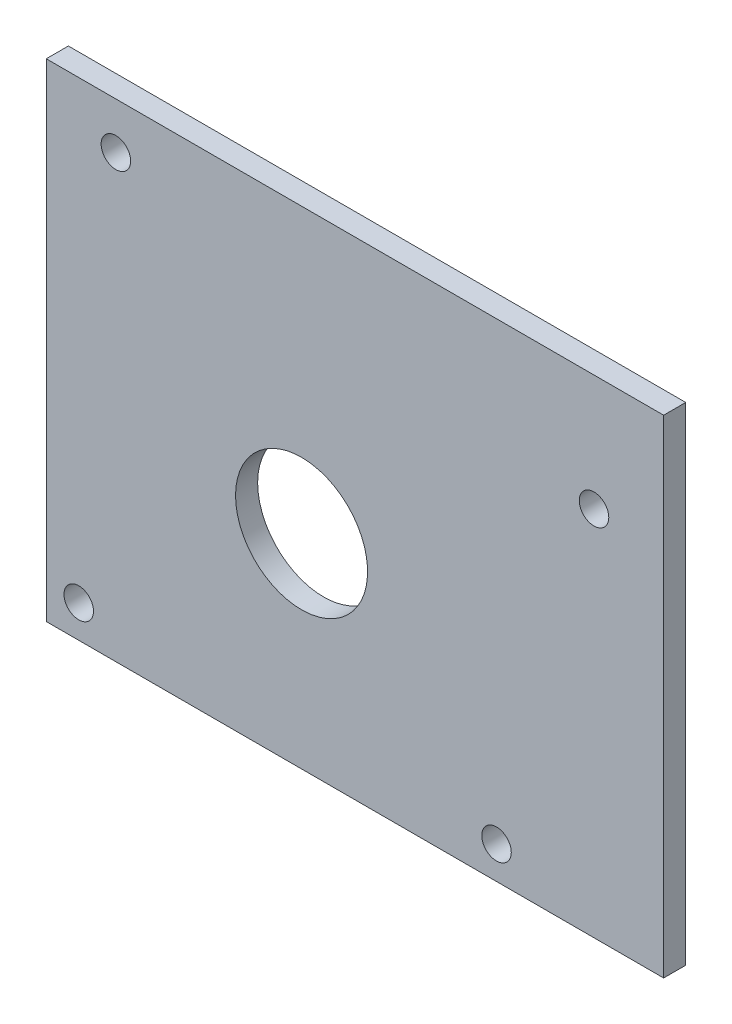
ISO-10303-21;
HEADER;
FILE_DESCRIPTION(('STEP AP214'),'2;1');
FILE_NAME('part.step','',(''),(''),'','','');
FILE_SCHEMA(('AUTOMOTIVE_DESIGN { 1 0 10303 214 1 1 1 1 }'));
ENDSEC;
DATA;
#1=APPLICATION_CONTEXT('core data for automotive mechanical design processes');
#2=APPLICATION_PROTOCOL_DEFINITION('international standard','automotive_design',2000,#1);
#3=PRODUCT_CONTEXT('',#1,'mechanical');
#4=PRODUCT('Part','Part','',(#3));
#5=PRODUCT_RELATED_PRODUCT_CATEGORY('part','',(#4));
#6=PRODUCT_DEFINITION_FORMATION('','',#4);
#7=PRODUCT_DEFINITION_CONTEXT('part definition',#1,'design');
#8=PRODUCT_DEFINITION('design','',#6,#7);
#9=PRODUCT_DEFINITION_SHAPE('','',#8);
#10=(LENGTH_UNIT() NAMED_UNIT(*) SI_UNIT(.MILLI.,.METRE.));
#11=(NAMED_UNIT(*) PLANE_ANGLE_UNIT() SI_UNIT($,.RADIAN.));
#12=(NAMED_UNIT(*) SI_UNIT($,.STERADIAN.) SOLID_ANGLE_UNIT());
#13=UNCERTAINTY_MEASURE_WITH_UNIT(LENGTH_MEASURE(1.E-05),#10,'distance_accuracy_value','');
#14=(GEOMETRIC_REPRESENTATION_CONTEXT(3) GLOBAL_UNCERTAINTY_ASSIGNED_CONTEXT((#13)) GLOBAL_UNIT_ASSIGNED_CONTEXT((#10,
#11,#12)) REPRESENTATION_CONTEXT('',''));
#15=CARTESIAN_POINT('',(0.,0.,0.));
#16=DIRECTION('',(0.,0.,1.));
#17=DIRECTION('',(1.,0.,0.));
#18=AXIS2_PLACEMENT_3D('',#15,#16,#17);
#19=CARTESIAN_POINT('',(0.,0.,4.7625));
#20=DIRECTION('',(0.,0.,-1.));
#21=DIRECTION('',(-1.,0.,0.));
#22=AXIS2_PLACEMENT_3D('',#19,#20,#21);
#23=PLANE('',#22);
#24=CARTESIAN_POINT('',(-70.0354609929079,64.3412711777844,4.7625));
#25=DIRECTION('',(0.,0.,1.));
#26=DIRECTION('',(1.,0.,0.));
#27=AXIS2_PLACEMENT_3D('',#24,#25,#26);
#28=CIRCLE('',#27,3.18);
#29=CARTESIAN_POINT('',(-66.8554609929079,64.3412711777844,4.7625));
#30=VERTEX_POINT('',#29);
#31=EDGE_CURVE('E115',#30,#30,#28,.T.);
#32=ORIENTED_EDGE('',*,*,#31,.F.);
#33=EDGE_LOOP('',(#32));
#34=FACE_BOUND('',#33,.T.);
#35=CARTESIAN_POINT('',(32.9645390070922,49.3412711777844,4.7625));
#36=DIRECTION('',(0.,0.,1.));
#37=DIRECTION('',(1.,0.,0.));
#38=AXIS2_PLACEMENT_3D('',#35,#36,#37);
#39=CIRCLE('',#38,3.18);
#40=CARTESIAN_POINT('',(36.1445390070922,49.3412711777844,4.7625));
#41=VERTEX_POINT('',#40);
#42=EDGE_CURVE('E133',#41,#41,#39,.T.);
#43=ORIENTED_EDGE('',*,*,#42,.F.);
#44=EDGE_LOOP('',(#43));
#45=FACE_BOUND('',#44,.T.);
#46=CARTESIAN_POINT('',(11.9645390070922,-23.6587288222156,4.7625));
#47=DIRECTION('',(0.,0.,1.));
#48=DIRECTION('',(1.,0.,0.));
#49=AXIS2_PLACEMENT_3D('',#46,#47,#48);
#50=CIRCLE('',#49,3.18);
#51=CARTESIAN_POINT('',(15.1445390070922,-23.6587288222156,4.7625));
#52=VERTEX_POINT('',#51);
#53=EDGE_CURVE('E127',#52,#52,#50,.T.);
#54=ORIENTED_EDGE('',*,*,#53,.F.);
#55=EDGE_LOOP('',(#54));
#56=FACE_BOUND('',#55,.T.);
#57=CARTESIAN_POINT('',(-78.0354609929079,-23.6587288222156,4.7625));
#58=DIRECTION('',(0.,0.,1.));
#59=DIRECTION('',(1.,0.,0.));
#60=AXIS2_PLACEMENT_3D('',#57,#58,#59);
#61=CIRCLE('',#60,3.18);
#62=CARTESIAN_POINT('',(-74.8554609929079,-23.6587288222156,4.7625));
#63=VERTEX_POINT('',#62);
#64=EDGE_CURVE('E121',#63,#63,#61,.T.);
#65=ORIENTED_EDGE('',*,*,#64,.F.);
#66=EDGE_LOOP('',(#65));
#67=FACE_BOUND('',#66,.T.);
#68=DIRECTION('',(-1.,0.,0.));
#69=VECTOR('',#68,1.);
#70=CARTESIAN_POINT('',(-85.0354609929079,74.3412711777844,4.7625));
#71=LINE('',#70,#69);
#72=CARTESIAN_POINT('',(47.9645390070921,74.3412711777844,4.7625));
#73=VERTEX_POINT('',#72);
#74=CARTESIAN_POINT('',(-85.0354609929079,74.3412711777844,4.7625));
#75=VERTEX_POINT('',#74);
#76=EDGE_CURVE('E85',#73,#75,#71,.T.);
#77=ORIENTED_EDGE('',*,*,#76,.T.);
#78=DIRECTION('',(0.,-1.,0.));
#79=VECTOR('',#78,1.);
#80=CARTESIAN_POINT('',(-85.0354609929079,74.3412711777844,4.7625));
#81=LINE('',#80,#79);
#82=CARTESIAN_POINT('',(-85.0354609929078,-30.6587288222156,4.7625));
#83=VERTEX_POINT('',#82);
#84=EDGE_CURVE('E80',#75,#83,#81,.T.);
#85=ORIENTED_EDGE('',*,*,#84,.T.);
#86=DIRECTION('',(1.,0.,0.));
#87=VECTOR('',#86,1.);
#88=CARTESIAN_POINT('',(-85.0354609929078,-30.6587288222156,4.7625));
#89=LINE('',#88,#87);
#90=CARTESIAN_POINT('',(47.9645390070922,-30.6587288222156,4.7625));
#91=VERTEX_POINT('',#90);
#92=EDGE_CURVE('E83',#83,#91,#89,.T.);
#93=ORIENTED_EDGE('',*,*,#92,.T.);
#94=DIRECTION('',(0.,1.,0.));
#95=VECTOR('',#94,1.);
#96=CARTESIAN_POINT('',(47.9645390070921,74.3412711777844,4.7625));
#97=LINE('',#96,#95);
#98=EDGE_CURVE('E50',#91,#73,#97,.T.);
#99=ORIENTED_EDGE('',*,*,#98,.T.);
#100=EDGE_LOOP('',(#77,#85,#93,#99));
#101=FACE_BOUND('',#100,.T.);
#102=CARTESIAN_POINT('',(-30.0354609929078,13.2612589574004,4.7625));
#103=DIRECTION('',(0.,0.,1.));
#104=DIRECTION('',(1.,0.,0.));
#105=AXIS2_PLACEMENT_3D('',#102,#103,#104);
#106=CIRCLE('',#105,14.225);
#107=CARTESIAN_POINT('',(-44.2604609929078,13.2612589574004,4.7625));
#108=VERTEX_POINT('',#107);
#109=EDGE_CURVE('E100',#108,#108,#106,.T.);
#110=ORIENTED_EDGE('',*,*,#109,.F.);
#111=EDGE_LOOP('',(#110));
#112=FACE_BOUND('',#111,.T.);
#113=ADVANCED_FACE('F33',(#34,#45,#56,#67,#101,#112),#23,.F.);
#114=CARTESIAN_POINT('',(0.,0.,0.));
#115=DIRECTION('',(0.,0.,-1.));
#116=DIRECTION('',(-1.,0.,0.));
#117=AXIS2_PLACEMENT_3D('',#114,#115,#116);
#118=PLANE('',#117);
#119=CARTESIAN_POINT('',(-70.0354609929079,64.3412711777844,0.));
#120=DIRECTION('',(0.,0.,-1.));
#121=DIRECTION('',(-1.,0.,0.));
#122=AXIS2_PLACEMENT_3D('',#119,#120,#121);
#123=CIRCLE('',#122,3.18);
#124=CARTESIAN_POINT('',(-73.2154609929079,64.3412711777844,0.));
#125=VERTEX_POINT('',#124);
#126=EDGE_CURVE('E136',#125,#125,#123,.F.);
#127=ORIENTED_EDGE('',*,*,#126,.T.);
#128=EDGE_LOOP('',(#127));
#129=FACE_BOUND('',#128,.T.);
#130=CARTESIAN_POINT('',(32.9645390070922,49.3412711777844,0.));
#131=DIRECTION('',(0.,0.,-1.));
#132=DIRECTION('',(-1.,0.,0.));
#133=AXIS2_PLACEMENT_3D('',#130,#131,#132);
#134=CIRCLE('',#133,3.18);
#135=CARTESIAN_POINT('',(29.7845390070922,49.3412711777844,0.));
#136=VERTEX_POINT('',#135);
#137=EDGE_CURVE('E130',#136,#136,#134,.F.);
#138=ORIENTED_EDGE('',*,*,#137,.T.);
#139=EDGE_LOOP('',(#138));
#140=FACE_BOUND('',#139,.T.);
#141=CARTESIAN_POINT('',(11.9645390070922,-23.6587288222156,0.));
#142=DIRECTION('',(0.,0.,-1.));
#143=DIRECTION('',(-1.,0.,0.));
#144=AXIS2_PLACEMENT_3D('',#141,#142,#143);
#145=CIRCLE('',#144,3.18);
#146=CARTESIAN_POINT('',(8.78453900709217,-23.6587288222156,0.));
#147=VERTEX_POINT('',#146);
#148=EDGE_CURVE('E124',#147,#147,#145,.F.);
#149=ORIENTED_EDGE('',*,*,#148,.T.);
#150=EDGE_LOOP('',(#149));
#151=FACE_BOUND('',#150,.T.);
#152=CARTESIAN_POINT('',(-78.0354609929079,-23.6587288222156,0.));
#153=DIRECTION('',(0.,0.,-1.));
#154=DIRECTION('',(-1.,0.,0.));
#155=AXIS2_PLACEMENT_3D('',#152,#153,#154);
#156=CIRCLE('',#155,3.18);
#157=CARTESIAN_POINT('',(-81.2154609929079,-23.6587288222156,0.));
#158=VERTEX_POINT('',#157);
#159=EDGE_CURVE('E118',#158,#158,#156,.F.);
#160=ORIENTED_EDGE('',*,*,#159,.T.);
#161=EDGE_LOOP('',(#160));
#162=FACE_BOUND('',#161,.T.);
#163=DIRECTION('',(-1.,0.,0.));
#164=VECTOR('',#163,1.);
#165=CARTESIAN_POINT('',(-85.0354609929079,74.3412711777844,0.));
#166=LINE('',#165,#164);
#167=CARTESIAN_POINT('',(47.9645390070921,74.3412711777844,0.));
#168=VERTEX_POINT('',#167);
#169=CARTESIAN_POINT('',(-85.0354609929079,74.3412711777844,0.));
#170=VERTEX_POINT('',#169);
#171=EDGE_CURVE('E97',#168,#170,#166,.T.);
#172=ORIENTED_EDGE('',*,*,#171,.F.);
#173=DIRECTION('',(0.,1.,0.));
#174=VECTOR('',#173,1.);
#175=CARTESIAN_POINT('',(47.9645390070921,74.3412711777844,0.));
#176=LINE('',#175,#174);
#177=CARTESIAN_POINT('',(47.9645390070922,-30.6587288222156,0.));
#178=VERTEX_POINT('',#177);
#179=EDGE_CURVE('E73',#178,#168,#176,.T.);
#180=ORIENTED_EDGE('',*,*,#179,.F.);
#181=DIRECTION('',(1.,0.,0.));
#182=VECTOR('',#181,1.);
#183=CARTESIAN_POINT('',(-85.0354609929078,-30.6587288222156,0.));
#184=LINE('',#183,#182);
#185=CARTESIAN_POINT('',(-85.0354609929078,-30.6587288222156,0.));
#186=VERTEX_POINT('',#185);
#187=EDGE_CURVE('E67',#186,#178,#184,.T.);
#188=ORIENTED_EDGE('',*,*,#187,.F.);
#189=DIRECTION('',(0.,-1.,0.));
#190=VECTOR('',#189,1.);
#191=CARTESIAN_POINT('',(-85.0354609929079,74.3412711777844,0.));
#192=LINE('',#191,#190);
#193=EDGE_CURVE('E89',#170,#186,#192,.T.);
#194=ORIENTED_EDGE('',*,*,#193,.F.);
#195=EDGE_LOOP('',(#172,#180,#188,#194));
#196=FACE_BOUND('',#195,.T.);
#197=CARTESIAN_POINT('',(-30.0354609929078,13.2612589574004,0.));
#198=DIRECTION('',(0.,0.,1.));
#199=DIRECTION('',(1.,0.,0.));
#200=AXIS2_PLACEMENT_3D('',#197,#198,#199);
#201=CIRCLE('',#200,14.225);
#202=CARTESIAN_POINT('',(-44.2604609929078,13.2612589574004,0.));
#203=VERTEX_POINT('',#202);
#204=EDGE_CURVE('E112',#203,#203,#201,.T.);
#205=ORIENTED_EDGE('',*,*,#204,.T.);
#206=EDGE_LOOP('',(#205));
#207=FACE_BOUND('',#206,.T.);
#208=ADVANCED_FACE('F108',(#129,#140,#151,#162,#196,#207),#118,.T.);
#209=CARTESIAN_POINT('',(-85.0354609929079,74.3412711777844,4.7625));
#210=DIRECTION('',(0.,-1.,0.));
#211=DIRECTION('',(1.,0.,0.));
#212=AXIS2_PLACEMENT_3D('',#209,#210,#211);
#213=PLANE('',#212);
#214=ORIENTED_EDGE('',*,*,#171,.T.);
#215=DIRECTION('',(0.,0.,-1.));
#216=VECTOR('',#215,1.);
#217=CARTESIAN_POINT('',(-85.0354609929079,74.3412711777844,4.7625));
#218=LINE('',#217,#216);
#219=EDGE_CURVE('E11',#75,#170,#218,.T.);
#220=ORIENTED_EDGE('',*,*,#219,.F.);
#221=ORIENTED_EDGE('',*,*,#76,.F.);
#222=DIRECTION('',(0.,0.,-1.));
#223=VECTOR('',#222,1.);
#224=CARTESIAN_POINT('',(47.9645390070921,74.3412711777844,4.7625));
#225=LINE('',#224,#223);
#226=EDGE_CURVE('E93',#73,#168,#225,.T.);
#227=ORIENTED_EDGE('',*,*,#226,.T.);
#228=EDGE_LOOP('',(#214,#220,#221,#227));
#229=FACE_BOUND('',#228,.T.);
#230=ADVANCED_FACE('F35',(#229),#213,.F.);
#231=CARTESIAN_POINT('',(-85.0354609929079,74.3412711777844,4.7625));
#232=DIRECTION('',(1.,0.,0.));
#233=DIRECTION('',(0.,1.,0.));
#234=AXIS2_PLACEMENT_3D('',#231,#232,#233);
#235=PLANE('',#234);
#236=ORIENTED_EDGE('',*,*,#193,.T.);
#237=DIRECTION('',(0.,0.,-1.));
#238=VECTOR('',#237,1.);
#239=CARTESIAN_POINT('',(-85.0354609929078,-30.6587288222156,4.7625));
#240=LINE('',#239,#238);
#241=EDGE_CURVE('E42',#83,#186,#240,.T.);
#242=ORIENTED_EDGE('',*,*,#241,.F.);
#243=ORIENTED_EDGE('',*,*,#84,.F.);
#244=ORIENTED_EDGE('',*,*,#219,.T.);
#245=EDGE_LOOP('',(#236,#242,#243,#244));
#246=FACE_BOUND('',#245,.T.);
#247=ADVANCED_FACE('F88',(#246),#235,.F.);
#248=CARTESIAN_POINT('',(-85.0354609929078,-30.6587288222156,4.7625));
#249=DIRECTION('',(0.,1.,0.));
#250=DIRECTION('',(-1.,0.,0.));
#251=AXIS2_PLACEMENT_3D('',#248,#249,#250);
#252=PLANE('',#251);
#253=ORIENTED_EDGE('',*,*,#187,.T.);
#254=DIRECTION('',(0.,0.,-1.));
#255=VECTOR('',#254,1.);
#256=CARTESIAN_POINT('',(47.9645390070922,-30.6587288222156,4.7625));
#257=LINE('',#256,#255);
#258=EDGE_CURVE('E90',#91,#178,#257,.T.);
#259=ORIENTED_EDGE('',*,*,#258,.F.);
#260=ORIENTED_EDGE('',*,*,#92,.F.);
#261=ORIENTED_EDGE('',*,*,#241,.T.);
#262=EDGE_LOOP('',(#253,#259,#260,#261));
#263=FACE_BOUND('',#262,.T.);
#264=ADVANCED_FACE('F91',(#263),#252,.F.);
#265=CARTESIAN_POINT('',(47.9645390070921,74.3412711777844,4.7625));
#266=DIRECTION('',(-1.,0.,0.));
#267=DIRECTION('',(0.,-1.,0.));
#268=AXIS2_PLACEMENT_3D('',#265,#266,#267);
#269=PLANE('',#268);
#270=ORIENTED_EDGE('',*,*,#179,.T.);
#271=ORIENTED_EDGE('',*,*,#226,.F.);
#272=ORIENTED_EDGE('',*,*,#98,.F.);
#273=ORIENTED_EDGE('',*,*,#258,.T.);
#274=EDGE_LOOP('',(#270,#271,#272,#273));
#275=FACE_BOUND('',#274,.T.);
#276=ADVANCED_FACE('F105',(#275),#269,.F.);
#277=CARTESIAN_POINT('',(-30.0354609929078,13.2612589574004,4.7625));
#278=DIRECTION('',(0.,0.,-1.));
#279=DIRECTION('',(-1.,0.,0.));
#280=AXIS2_PLACEMENT_3D('',#277,#278,#279);
#281=CYLINDRICAL_SURFACE('',#280,14.225);
#282=CARTESIAN_POINT('',(-44.2604609929078,13.2612589574004,4.7625));
#283=CARTESIAN_POINT('',(-44.2604609929078,13.2612589574004,4.712890625));
#284=CARTESIAN_POINT('',(-44.2604609929078,13.2612589574004,4.66328125));
#285=CARTESIAN_POINT('',(-44.2604609929078,13.2612589574004,4.5640625));
#286=CARTESIAN_POINT('',(-44.2604609929078,13.2612589574004,4.514453125));
#287=CARTESIAN_POINT('',(-44.2604609929078,13.2612589574004,4.415234375));
#288=CARTESIAN_POINT('',(-44.2604609929078,13.2612589574004,4.365625));
#289=CARTESIAN_POINT('',(-44.2604609929078,13.2612589574004,4.26640625));
#290=CARTESIAN_POINT('',(-44.2604609929078,13.2612589574004,4.216796875));
#291=CARTESIAN_POINT('',(-44.2604609929078,13.2612589574004,4.117578125));
#292=CARTESIAN_POINT('',(-44.2604609929078,13.2612589574004,4.06796875));
#293=CARTESIAN_POINT('',(-44.2604609929078,13.2612589574004,3.96875));
#294=CARTESIAN_POINT('',(-44.2604609929078,13.2612589574004,3.919140625));
#295=CARTESIAN_POINT('',(-44.2604609929078,13.2612589574004,3.819921875));
#296=CARTESIAN_POINT('',(-44.2604609929078,13.2612589574004,3.7703125));
#297=CARTESIAN_POINT('',(-44.2604609929078,13.2612589574004,3.67109375));
#298=CARTESIAN_POINT('',(-44.2604609929078,13.2612589574004,3.621484375));
#299=CARTESIAN_POINT('',(-44.2604609929078,13.2612589574004,3.522265625));
#300=CARTESIAN_POINT('',(-44.2604609929078,13.2612589574004,3.47265625));
#301=CARTESIAN_POINT('',(-44.2604609929078,13.2612589574004,3.3734375));
#302=CARTESIAN_POINT('',(-44.2604609929078,13.2612589574004,3.323828125));
#303=CARTESIAN_POINT('',(-44.2604609929078,13.2612589574004,3.224609375));
#304=CARTESIAN_POINT('',(-44.2604609929078,13.2612589574004,3.175));
#305=CARTESIAN_POINT('',(-44.2604609929078,13.2612589574004,3.07578125));
#306=CARTESIAN_POINT('',(-44.2604609929078,13.2612589574004,3.026171875));
#307=CARTESIAN_POINT('',(-44.2604609929078,13.2612589574004,2.926953125));
#308=CARTESIAN_POINT('',(-44.2604609929078,13.2612589574004,2.87734375));
#309=CARTESIAN_POINT('',(-44.2604609929078,13.2612589574004,2.778125));
#310=CARTESIAN_POINT('',(-44.2604609929078,13.2612589574004,2.728515625));
#311=CARTESIAN_POINT('',(-44.2604609929078,13.2612589574004,2.629296875));
#312=CARTESIAN_POINT('',(-44.2604609929078,13.2612589574004,2.5796875));
#313=CARTESIAN_POINT('',(-44.2604609929078,13.2612589574004,2.48046875));
#314=CARTESIAN_POINT('',(-44.2604609929078,13.2612589574004,2.430859375));
#315=CARTESIAN_POINT('',(-44.2604609929078,13.2612589574004,2.331640625));
#316=CARTESIAN_POINT('',(-44.2604609929078,13.2612589574004,2.28203125));
#317=CARTESIAN_POINT('',(-44.2604609929078,13.2612589574004,2.1828125));
#318=CARTESIAN_POINT('',(-44.2604609929078,13.2612589574004,2.133203125));
#319=CARTESIAN_POINT('',(-44.2604609929078,13.2612589574004,2.033984375));
#320=CARTESIAN_POINT('',(-44.2604609929078,13.2612589574004,1.984375));
#321=CARTESIAN_POINT('',(-44.2604609929078,13.2612589574004,1.88515625));
#322=CARTESIAN_POINT('',(-44.2604609929078,13.2612589574004,1.835546875));
#323=CARTESIAN_POINT('',(-44.2604609929078,13.2612589574004,1.736328125));
#324=CARTESIAN_POINT('',(-44.2604609929078,13.2612589574004,1.68671875));
#325=CARTESIAN_POINT('',(-44.2604609929078,13.2612589574004,1.5875));
#326=CARTESIAN_POINT('',(-44.2604609929078,13.2612589574004,1.537890625));
#327=CARTESIAN_POINT('',(-44.2604609929078,13.2612589574004,1.438671875));
#328=CARTESIAN_POINT('',(-44.2604609929078,13.2612589574004,1.3890625));
#329=CARTESIAN_POINT('',(-44.2604609929078,13.2612589574004,1.28984375));
#330=CARTESIAN_POINT('',(-44.2604609929078,13.2612589574004,1.240234375));
#331=CARTESIAN_POINT('',(-44.2604609929078,13.2612589574004,1.141015625));
#332=CARTESIAN_POINT('',(-44.2604609929078,13.2612589574004,1.09140625));
#333=CARTESIAN_POINT('',(-44.2604609929078,13.2612589574004,0.992187499999999));
#334=CARTESIAN_POINT('',(-44.2604609929078,13.2612589574004,0.942578124999999));
#335=CARTESIAN_POINT('',(-44.2604609929078,13.2612589574004,0.843359375));
#336=CARTESIAN_POINT('',(-44.2604609929078,13.2612589574004,0.79375));
#337=CARTESIAN_POINT('',(-44.2604609929078,13.2612589574004,0.69453125));
#338=CARTESIAN_POINT('',(-44.2604609929078,13.2612589574004,0.644921875));
#339=CARTESIAN_POINT('',(-44.2604609929078,13.2612589574004,0.545703125));
#340=CARTESIAN_POINT('',(-44.2604609929078,13.2612589574004,0.49609375));
#341=CARTESIAN_POINT('',(-44.2604609929078,13.2612589574004,0.396875));
#342=CARTESIAN_POINT('',(-44.2604609929078,13.2612589574004,0.347265625));
#343=CARTESIAN_POINT('',(-44.2604609929078,13.2612589574004,0.248046875));
#344=CARTESIAN_POINT('',(-44.2604609929078,13.2612589574004,0.1984375));
#345=CARTESIAN_POINT('',(-44.2604609929078,13.2612589574004,0.09921875));
#346=CARTESIAN_POINT('',(-44.2604609929078,13.2612589574004,0.049609375));
#347=CARTESIAN_POINT('',(-44.2604609929078,13.2612589574004,0.));
#348=B_SPLINE_CURVE_WITH_KNOTS('',3,(#282,#283,#284,#285,#286,#287,#288,#289,#290,#291,#292,
#293,#294,#295,#296,#297,#298,#299,#300,#301,#302,#303,#304,#305,#306,#307,#308,#309,#310,#311,
#312,#313,#314,#315,#316,#317,#318,#319,#320,#321,#322,#323,#324,#325,#326,#327,#328,#329,#330,
#331,#332,#333,#334,#335,#336,#337,#338,#339,#340,#341,#342,#343,#344,#345,#346,#347),
.UNSPECIFIED.,.F.,.F.,(4,2,2,2,2,2,2,2,2,2,2,2,2,2,2,2,2,2,2,2,2,2,2,2,2,2,2,2,2,2,2,2,4),(0.,
0.148828125,0.29765625,0.446484375,0.5953125,0.744140625,0.892968750000001,1.041796875,1.190625,
1.339453125,1.48828125,1.637109375,1.7859375,1.934765625,2.08359375,2.232421875,2.38125,
2.530078125,2.67890625,2.827734375,2.9765625,3.125390625,3.27421875,3.423046875,3.571875,
3.720703125,3.86953125,4.018359375,4.1671875,4.316015625,4.46484375,4.613671875,4.7625),.UNSPECIFIED.);
#349=EDGE_CURVE('BSEAM156',#108,#203,#348,.T.);
#350=ORIENTED_EDGE('',*,*,#109,.T.);
#351=ORIENTED_EDGE('',*,*,#204,.F.);
#352=ORIENTED_EDGE('',*,*,#349,.T.);
#353=ORIENTED_EDGE('',*,*,#349,.F.);
#354=EDGE_LOOP('',(#350,#352,#351,#353));
#355=FACE_BOUND('',#354,.T.);
#356=ADVANCED_FACE('F156',(#355),#281,.F.);
#357=CARTESIAN_POINT('',(-78.0354609929079,-23.6587288222156,-0.00100000000000013));
#358=DIRECTION('',(0.,0.,1.));
#359=DIRECTION('',(1.,0.,0.));
#360=AXIS2_PLACEMENT_3D('',#357,#358,#359);
#361=CYLINDRICAL_SURFACE('',#360,3.18);
#362=ORIENTED_EDGE('',*,*,#159,.F.);
#363=EDGE_LOOP('',(#362));
#364=FACE_BOUND('',#363,.T.);
#365=ORIENTED_EDGE('',*,*,#64,.T.);
#366=EDGE_LOOP('',(#365));
#367=FACE_BOUND('',#366,.T.);
#368=ADVANCED_FACE('F153',(#364,#367),#361,.F.);
#369=CARTESIAN_POINT('',(11.9645390070922,-23.6587288222156,-0.00100000000000013));
#370=DIRECTION('',(0.,0.,1.));
#371=DIRECTION('',(1.,0.,0.));
#372=AXIS2_PLACEMENT_3D('',#369,#370,#371);
#373=CYLINDRICAL_SURFACE('',#372,3.18);
#374=ORIENTED_EDGE('',*,*,#148,.F.);
#375=EDGE_LOOP('',(#374));
#376=FACE_BOUND('',#375,.T.);
#377=ORIENTED_EDGE('',*,*,#53,.T.);
#378=EDGE_LOOP('',(#377));
#379=FACE_BOUND('',#378,.T.);
#380=ADVANCED_FACE('F155',(#376,#379),#373,.F.);
#381=CARTESIAN_POINT('',(32.9645390070922,49.3412711777844,-0.00100000000000013));
#382=DIRECTION('',(0.,0.,1.));
#383=DIRECTION('',(1.,0.,0.));
#384=AXIS2_PLACEMENT_3D('',#381,#382,#383);
#385=CYLINDRICAL_SURFACE('',#384,3.18);
#386=ORIENTED_EDGE('',*,*,#137,.F.);
#387=EDGE_LOOP('',(#386));
#388=FACE_BOUND('',#387,.T.);
#389=ORIENTED_EDGE('',*,*,#42,.T.);
#390=EDGE_LOOP('',(#389));
#391=FACE_BOUND('',#390,.T.);
#392=ADVANCED_FACE('F163',(#388,#391),#385,.F.);
#393=CARTESIAN_POINT('',(-70.0354609929079,64.3412711777844,-0.00100000000000013));
#394=DIRECTION('',(0.,0.,1.));
#395=DIRECTION('',(1.,0.,0.));
#396=AXIS2_PLACEMENT_3D('',#393,#394,#395);
#397=CYLINDRICAL_SURFACE('',#396,3.18);
#398=ORIENTED_EDGE('',*,*,#126,.F.);
#399=EDGE_LOOP('',(#398));
#400=FACE_BOUND('',#399,.T.);
#401=ORIENTED_EDGE('',*,*,#31,.T.);
#402=EDGE_LOOP('',(#401));
#403=FACE_BOUND('',#402,.T.);
#404=ADVANCED_FACE('F142',(#400,#403),#397,.F.);
#405=CLOSED_SHELL('',(#113,#208,#230,#247,#264,#276,#356,#368,#380,#392,#404));
#406=MANIFOLD_SOLID_BREP('B2',#405);
#407=ADVANCED_BREP_SHAPE_REPRESENTATION('',(#18,#406),#14);
#408=SHAPE_DEFINITION_REPRESENTATION(#9,#407);
ENDSEC;
END-ISO-10303-21;
